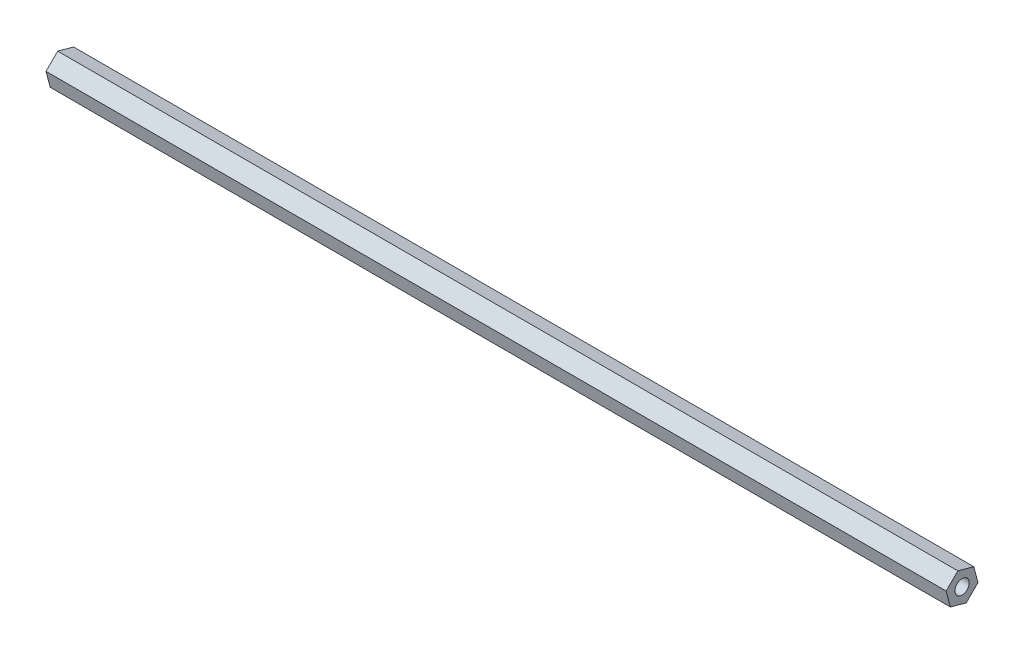
ISO-10303-21;
HEADER;
FILE_DESCRIPTION(('STEP AP214'),'2;1');
FILE_NAME('part.step','',(''),(''),'','','');
FILE_SCHEMA(('AUTOMOTIVE_DESIGN { 1 0 10303 214 1 1 1 1 }'));
ENDSEC;
DATA;
#1=APPLICATION_CONTEXT('core data for automotive mechanical design processes');
#2=APPLICATION_PROTOCOL_DEFINITION('international standard','automotive_design',2000,#1);
#3=PRODUCT_CONTEXT('',#1,'mechanical');
#4=PRODUCT('Part','Part','',(#3));
#5=PRODUCT_RELATED_PRODUCT_CATEGORY('part','',(#4));
#6=PRODUCT_DEFINITION_FORMATION('','',#4);
#7=PRODUCT_DEFINITION_CONTEXT('part definition',#1,'design');
#8=PRODUCT_DEFINITION('design','',#6,#7);
#9=PRODUCT_DEFINITION_SHAPE('','',#8);
#10=(LENGTH_UNIT() NAMED_UNIT(*) SI_UNIT(.MILLI.,.METRE.));
#11=(NAMED_UNIT(*) PLANE_ANGLE_UNIT() SI_UNIT($,.RADIAN.));
#12=(NAMED_UNIT(*) SI_UNIT($,.STERADIAN.) SOLID_ANGLE_UNIT());
#13=UNCERTAINTY_MEASURE_WITH_UNIT(LENGTH_MEASURE(1.E-05),#10,'distance_accuracy_value','');
#14=(GEOMETRIC_REPRESENTATION_CONTEXT(3) GLOBAL_UNCERTAINTY_ASSIGNED_CONTEXT((#13)) GLOBAL_UNIT_ASSIGNED_CONTEXT((#10,
#11,#12)) REPRESENTATION_CONTEXT('',''));
#15=CARTESIAN_POINT('',(0.,0.,0.));
#16=DIRECTION('',(0.,0.,1.));
#17=DIRECTION('',(1.,0.,0.));
#18=AXIS2_PLACEMENT_3D('',#15,#16,#17);
#19=CARTESIAN_POINT('',(400.05,-1.92681784977775,-7.07465238065527));
#20=DIRECTION('',(0.,-0.254850544088576,0.9669804549099));
#21=DIRECTION('',(0.,-0.9669804549099,-0.254850544088576));
#22=AXIS2_PLACEMENT_3D('',#19,#20,#21);
#23=PLANE('',#22);
#24=DIRECTION('',(0.,0.9669804549099,0.254850544088576));
#25=VECTOR('',#24,1.);
#26=CARTESIAN_POINT('',(0.,-1.92681784977775,-7.07465238065527));
#27=LINE('',#26,#25);
#28=CARTESIAN_POINT('',(0.,-1.92681784977775,-7.07465238065527));
#29=VERTEX_POINT('',#28);
#30=CARTESIAN_POINT('',(0.,5.16341975970264,-5.20599939670046));
#31=VERTEX_POINT('',#30);
#32=EDGE_CURVE('E120',#29,#31,#27,.T.);
#33=ORIENTED_EDGE('',*,*,#32,.T.);
#34=DIRECTION('',(-1.,0.,0.));
#35=VECTOR('',#34,1.);
#36=CARTESIAN_POINT('',(400.05,5.16341975970264,-5.20599939670046));
#37=LINE('',#36,#35);
#38=CARTESIAN_POINT('',(400.05,5.16341975970264,-5.20599939670046));
#39=VERTEX_POINT('',#38);
#40=EDGE_CURVE('E11',#39,#31,#37,.T.);
#41=ORIENTED_EDGE('',*,*,#40,.F.);
#42=DIRECTION('',(0.,0.9669804549099,0.254850544088576));
#43=VECTOR('',#42,1.);
#44=CARTESIAN_POINT('',(400.05,-1.92681784977775,-7.07465238065527));
#45=LINE('',#44,#43);
#46=CARTESIAN_POINT('',(400.05,-1.92681784977775,-7.07465238065527));
#47=VERTEX_POINT('',#46);
#48=EDGE_CURVE('E131',#47,#39,#45,.T.);
#49=ORIENTED_EDGE('',*,*,#48,.F.);
#50=DIRECTION('',(-1.,0.,0.));
#51=VECTOR('',#50,1.);
#52=CARTESIAN_POINT('',(400.05,-1.92681784977775,-7.07465238065527));
#53=LINE('',#52,#51);
#54=EDGE_CURVE('E116',#47,#29,#53,.T.);
#55=ORIENTED_EDGE('',*,*,#54,.T.);
#56=EDGE_LOOP('',(#33,#41,#49,#55));
#57=FACE_BOUND('',#56,.T.);
#58=ADVANCED_FACE('F36',(#57),#23,.F.);
#59=CARTESIAN_POINT('',(400.05,5.16341975970264,-5.20599939670046));
#60=DIRECTION('',(0.,-0.964854910959294,0.262783182105958));
#61=DIRECTION('',(0.,-0.262783182105958,-0.964854910959294));
#62=AXIS2_PLACEMENT_3D('',#59,#60,#61);
#63=PLANE('',#62);
#64=DIRECTION('',(0.,0.262783182105958,0.964854910959294));
#65=VECTOR('',#64,1.);
#66=CARTESIAN_POINT('',(0.,5.16341975970264,-5.20599939670046));
#67=LINE('',#66,#65);
#68=CARTESIAN_POINT('',(0.,7.09023760948039,1.8686529839548));
#69=VERTEX_POINT('',#68);
#70=EDGE_CURVE('E123',#31,#69,#67,.T.);
#71=ORIENTED_EDGE('',*,*,#70,.T.);
#72=DIRECTION('',(-1.,0.,0.));
#73=VECTOR('',#72,1.);
#74=CARTESIAN_POINT('',(400.05,7.09023760948039,1.8686529839548));
#75=LINE('',#74,#73);
#76=CARTESIAN_POINT('',(400.05,7.09023760948039,1.8686529839548));
#77=VERTEX_POINT('',#76);
#78=EDGE_CURVE('E44',#77,#69,#75,.T.);
#79=ORIENTED_EDGE('',*,*,#78,.F.);
#80=DIRECTION('',(0.,0.262783182105958,0.964854910959294));
#81=VECTOR('',#80,1.);
#82=CARTESIAN_POINT('',(400.05,5.16341975970264,-5.20599939670046));
#83=LINE('',#82,#81);
#84=EDGE_CURVE('E89',#39,#77,#83,.T.);
#85=ORIENTED_EDGE('',*,*,#84,.F.);
#86=ORIENTED_EDGE('',*,*,#40,.T.);
#87=EDGE_LOOP('',(#71,#79,#85,#86));
#88=FACE_BOUND('',#87,.T.);
#89=ADVANCED_FACE('F156',(#88),#63,.F.);
#90=CARTESIAN_POINT('',(400.05,7.09023760948039,1.8686529839548));
#91=DIRECTION('',(0.,-0.710004366870719,-0.704197272803942));
#92=DIRECTION('',(0.,0.704197272803942,-0.710004366870719));
#93=AXIS2_PLACEMENT_3D('',#90,#91,#92);
#94=PLANE('',#93);
#95=DIRECTION('',(0.,-0.704197272803942,0.710004366870719));
#96=VECTOR('',#95,1.);
#97=CARTESIAN_POINT('',(0.,7.09023760948039,1.8686529839548));
#98=LINE('',#97,#96);
#99=CARTESIAN_POINT('',(0.,1.92681784977774,7.07465238065526));
#100=VERTEX_POINT('',#99);
#101=EDGE_CURVE('E126',#69,#100,#98,.T.);
#102=ORIENTED_EDGE('',*,*,#101,.T.);
#103=DIRECTION('',(-1.,0.,0.));
#104=VECTOR('',#103,1.);
#105=CARTESIAN_POINT('',(400.05,1.92681784977774,7.07465238065526));
#106=LINE('',#105,#104);
#107=CARTESIAN_POINT('',(400.05,1.92681784977774,7.07465238065526));
#108=VERTEX_POINT('',#107);
#109=EDGE_CURVE('E111',#108,#100,#106,.T.);
#110=ORIENTED_EDGE('',*,*,#109,.F.);
#111=DIRECTION('',(0.,-0.704197272803942,0.710004366870719));
#112=VECTOR('',#111,1.);
#113=CARTESIAN_POINT('',(400.05,7.09023760948039,1.8686529839548));
#114=LINE('',#113,#112);
#115=EDGE_CURVE('E102',#77,#108,#114,.T.);
#116=ORIENTED_EDGE('',*,*,#115,.F.);
#117=ORIENTED_EDGE('',*,*,#78,.T.);
#118=EDGE_LOOP('',(#102,#110,#116,#117));
#119=FACE_BOUND('',#118,.T.);
#120=ADVANCED_FACE('F137',(#119),#94,.F.);
#121=CARTESIAN_POINT('',(400.05,1.92681784977774,7.07465238065526));
#122=DIRECTION('',(0.,0.254850544088575,-0.9669804549099));
#123=DIRECTION('',(0.,0.9669804549099,0.254850544088575));
#124=AXIS2_PLACEMENT_3D('',#121,#122,#123);
#125=PLANE('',#124);
#126=DIRECTION('',(0.,-0.9669804549099,-0.254850544088575));
#127=VECTOR('',#126,1.);
#128=CARTESIAN_POINT('',(0.,1.92681784977774,7.07465238065526));
#129=LINE('',#128,#127);
#130=CARTESIAN_POINT('',(0.,-5.16341975970264,5.20599939670046));
#131=VERTEX_POINT('',#130);
#132=EDGE_CURVE('E110',#100,#131,#129,.T.);
#133=ORIENTED_EDGE('',*,*,#132,.T.);
#134=DIRECTION('',(-1.,0.,0.));
#135=VECTOR('',#134,1.);
#136=CARTESIAN_POINT('',(400.05,-5.16341975970264,5.20599939670046));
#137=LINE('',#136,#135);
#138=CARTESIAN_POINT('',(400.05,-5.16341975970264,5.20599939670046));
#139=VERTEX_POINT('',#138);
#140=EDGE_CURVE('E107',#139,#131,#137,.T.);
#141=ORIENTED_EDGE('',*,*,#140,.F.);
#142=DIRECTION('',(0.,-0.9669804549099,-0.254850544088575));
#143=VECTOR('',#142,1.);
#144=CARTESIAN_POINT('',(400.05,1.92681784977774,7.07465238065526));
#145=LINE('',#144,#143);
#146=EDGE_CURVE('E96',#108,#139,#145,.T.);
#147=ORIENTED_EDGE('',*,*,#146,.F.);
#148=ORIENTED_EDGE('',*,*,#109,.T.);
#149=EDGE_LOOP('',(#133,#141,#147,#148));
#150=FACE_BOUND('',#149,.T.);
#151=ADVANCED_FACE('F108',(#150),#125,.F.);
#152=CARTESIAN_POINT('',(400.05,-5.16341975970264,5.20599939670046));
#153=DIRECTION('',(0.,0.964854910959294,-0.262783182105958));
#154=DIRECTION('',(0.,0.262783182105958,0.964854910959294));
#155=AXIS2_PLACEMENT_3D('',#152,#153,#154);
#156=PLANE('',#155);
#157=DIRECTION('',(0.,-0.262783182105958,-0.964854910959294));
#158=VECTOR('',#157,1.);
#159=CARTESIAN_POINT('',(0.,-5.16341975970264,5.20599939670046));
#160=LINE('',#159,#158);
#161=CARTESIAN_POINT('',(0.,-7.09023760948039,-1.86865298395481));
#162=VERTEX_POINT('',#161);
#163=EDGE_CURVE('E75',#131,#162,#160,.T.);
#164=ORIENTED_EDGE('',*,*,#163,.T.);
#165=DIRECTION('',(-1.,0.,0.));
#166=VECTOR('',#165,1.);
#167=CARTESIAN_POINT('',(400.05,-7.09023760948039,-1.86865298395481));
#168=LINE('',#167,#166);
#169=CARTESIAN_POINT('',(400.05,-7.09023760948039,-1.86865298395481));
#170=VERTEX_POINT('',#169);
#171=EDGE_CURVE('E112',#170,#162,#168,.T.);
#172=ORIENTED_EDGE('',*,*,#171,.F.);
#173=DIRECTION('',(0.,-0.262783182105958,-0.964854910959294));
#174=VECTOR('',#173,1.);
#175=CARTESIAN_POINT('',(400.05,-5.16341975970264,5.20599939670046));
#176=LINE('',#175,#174);
#177=EDGE_CURVE('E100',#139,#170,#176,.T.);
#178=ORIENTED_EDGE('',*,*,#177,.F.);
#179=ORIENTED_EDGE('',*,*,#140,.T.);
#180=EDGE_LOOP('',(#164,#172,#178,#179));
#181=FACE_BOUND('',#180,.T.);
#182=ADVANCED_FACE('F114',(#181),#156,.F.);
#183=CARTESIAN_POINT('',(400.05,-7.09023760948039,-1.86865298395481));
#184=DIRECTION('',(0.,0.710004366870719,0.704197272803942));
#185=DIRECTION('',(0.,-0.704197272803942,0.710004366870719));
#186=AXIS2_PLACEMENT_3D('',#183,#184,#185);
#187=PLANE('',#186);
#188=DIRECTION('',(0.,0.704197272803942,-0.710004366870719));
#189=VECTOR('',#188,1.);
#190=CARTESIAN_POINT('',(0.,-7.09023760948039,-1.86865298395481));
#191=LINE('',#190,#189);
#192=EDGE_CURVE('E81',#162,#29,#191,.T.);
#193=ORIENTED_EDGE('',*,*,#192,.T.);
#194=ORIENTED_EDGE('',*,*,#54,.F.);
#195=DIRECTION('',(0.,0.704197272803942,-0.710004366870719));
#196=VECTOR('',#195,1.);
#197=CARTESIAN_POINT('',(400.05,-7.09023760948039,-1.86865298395481));
#198=LINE('',#197,#196);
#199=EDGE_CURVE('E52',#170,#47,#198,.T.);
#200=ORIENTED_EDGE('',*,*,#199,.F.);
#201=ORIENTED_EDGE('',*,*,#171,.T.);
#202=EDGE_LOOP('',(#193,#194,#200,#201));
#203=FACE_BOUND('',#202,.T.);
#204=ADVANCED_FACE('F144',(#203),#187,.F.);
#205=CARTESIAN_POINT('',(400.05,0.,0.));
#206=DIRECTION('',(1.,0.,0.));
#207=DIRECTION('',(0.,0.,-1.));
#208=AXIS2_PLACEMENT_3D('',#205,#206,#207);
#209=PLANE('',#208);
#210=CARTESIAN_POINT('',(400.05,0.,0.));
#211=DIRECTION('',(1.,0.,0.));
#212=DIRECTION('',(0.,0.,-1.));
#213=AXIS2_PLACEMENT_3D('',#210,#211,#212);
#214=CIRCLE('',#213,3.175);
#215=CARTESIAN_POINT('',(400.05,0.,-3.175));
#216=VERTEX_POINT('',#215);
#217=EDGE_CURVE('E211',#216,#216,#214,.T.);
#218=ORIENTED_EDGE('',*,*,#217,.F.);
#219=EDGE_LOOP('',(#218));
#220=FACE_BOUND('',#219,.T.);
#221=ORIENTED_EDGE('',*,*,#48,.T.);
#222=ORIENTED_EDGE('',*,*,#84,.T.);
#223=ORIENTED_EDGE('',*,*,#115,.T.);
#224=ORIENTED_EDGE('',*,*,#146,.T.);
#225=ORIENTED_EDGE('',*,*,#177,.T.);
#226=ORIENTED_EDGE('',*,*,#199,.T.);
#227=EDGE_LOOP('',(#221,#222,#223,#224,#225,#226));
#228=FACE_BOUND('',#227,.T.);
#229=ADVANCED_FACE('F98',(#220,#228),#209,.T.);
#230=CARTESIAN_POINT('',(0.,0.,0.));
#231=DIRECTION('',(1.,0.,0.));
#232=DIRECTION('',(0.,0.,-1.));
#233=AXIS2_PLACEMENT_3D('',#230,#231,#232);
#234=PLANE('',#233);
#235=CARTESIAN_POINT('',(0.,0.,0.));
#236=DIRECTION('',(1.,0.,0.));
#237=DIRECTION('',(0.,0.,-1.));
#238=AXIS2_PLACEMENT_3D('',#235,#236,#237);
#239=CIRCLE('',#238,3.175);
#240=CARTESIAN_POINT('',(0.,0.,-3.175));
#241=VERTEX_POINT('',#240);
#242=EDGE_CURVE('E124',#241,#241,#239,.T.);
#243=ORIENTED_EDGE('',*,*,#242,.T.);
#244=EDGE_LOOP('',(#243));
#245=FACE_BOUND('',#244,.T.);
#246=ORIENTED_EDGE('',*,*,#32,.F.);
#247=ORIENTED_EDGE('',*,*,#192,.F.);
#248=ORIENTED_EDGE('',*,*,#163,.F.);
#249=ORIENTED_EDGE('',*,*,#132,.F.);
#250=ORIENTED_EDGE('',*,*,#101,.F.);
#251=ORIENTED_EDGE('',*,*,#70,.F.);
#252=EDGE_LOOP('',(#246,#247,#248,#249,#250,#251));
#253=FACE_BOUND('',#252,.T.);
#254=ADVANCED_FACE('F140',(#245,#253),#234,.F.);
#255=CARTESIAN_POINT('',(0.,0.,0.));
#256=DIRECTION('',(1.,0.,0.));
#257=DIRECTION('',(0.,0.,-1.));
#258=AXIS2_PLACEMENT_3D('',#255,#256,#257);
#259=CYLINDRICAL_SURFACE('',#258,3.175);
#260=CARTESIAN_POINT('',(0.,0.,-3.175));
#261=CARTESIAN_POINT('',(4.1671875,0.,-3.175));
#262=CARTESIAN_POINT('',(8.334375,0.,-3.175));
#263=CARTESIAN_POINT('',(16.66875,0.,-3.175));
#264=CARTESIAN_POINT('',(20.8359375,0.,-3.175));
#265=CARTESIAN_POINT('',(29.1703125,0.,-3.175));
#266=CARTESIAN_POINT('',(33.3375,0.,-3.175));
#267=CARTESIAN_POINT('',(41.671875,0.,-3.175));
#268=CARTESIAN_POINT('',(45.8390625,0.,-3.175));
#269=CARTESIAN_POINT('',(54.1734375,0.,-3.175));
#270=CARTESIAN_POINT('',(58.340625,0.,-3.175));
#271=CARTESIAN_POINT('',(66.675,0.,-3.175));
#272=CARTESIAN_POINT('',(70.8421875,0.,-3.175));
#273=CARTESIAN_POINT('',(79.1765625,0.,-3.175));
#274=CARTESIAN_POINT('',(83.34375,0.,-3.175));
#275=CARTESIAN_POINT('',(91.678125,0.,-3.175));
#276=CARTESIAN_POINT('',(95.8453125,0.,-3.175));
#277=CARTESIAN_POINT('',(104.1796875,0.,-3.175));
#278=CARTESIAN_POINT('',(108.346875,0.,-3.175));
#279=CARTESIAN_POINT('',(116.68125,0.,-3.175));
#280=CARTESIAN_POINT('',(120.8484375,0.,-3.175));
#281=CARTESIAN_POINT('',(129.1828125,0.,-3.175));
#282=CARTESIAN_POINT('',(133.35,0.,-3.175));
#283=CARTESIAN_POINT('',(141.684375,0.,-3.175));
#284=CARTESIAN_POINT('',(145.8515625,0.,-3.175));
#285=CARTESIAN_POINT('',(154.1859375,0.,-3.175));
#286=CARTESIAN_POINT('',(158.353125,0.,-3.175));
#287=CARTESIAN_POINT('',(166.6875,0.,-3.175));
#288=CARTESIAN_POINT('',(170.8546875,0.,-3.175));
#289=CARTESIAN_POINT('',(179.1890625,0.,-3.175));
#290=CARTESIAN_POINT('',(183.35625,0.,-3.175));
#291=CARTESIAN_POINT('',(191.690625,0.,-3.175));
#292=CARTESIAN_POINT('',(195.8578125,0.,-3.175));
#293=CARTESIAN_POINT('',(204.1921875,0.,-3.175));
#294=CARTESIAN_POINT('',(208.359375,0.,-3.175));
#295=CARTESIAN_POINT('',(216.69375,0.,-3.175));
#296=CARTESIAN_POINT('',(220.8609375,0.,-3.175));
#297=CARTESIAN_POINT('',(229.1953125,0.,-3.175));
#298=CARTESIAN_POINT('',(233.3625,0.,-3.175));
#299=CARTESIAN_POINT('',(241.696875,0.,-3.175));
#300=CARTESIAN_POINT('',(245.8640625,0.,-3.175));
#301=CARTESIAN_POINT('',(254.1984375,0.,-3.175));
#302=CARTESIAN_POINT('',(258.365625,0.,-3.175));
#303=CARTESIAN_POINT('',(266.7,0.,-3.175));
#304=CARTESIAN_POINT('',(270.8671875,0.,-3.175));
#305=CARTESIAN_POINT('',(279.2015625,0.,-3.175));
#306=CARTESIAN_POINT('',(283.36875,0.,-3.175));
#307=CARTESIAN_POINT('',(291.703125,0.,-3.175));
#308=CARTESIAN_POINT('',(295.8703125,0.,-3.175));
#309=CARTESIAN_POINT('',(304.2046875,0.,-3.175));
#310=CARTESIAN_POINT('',(308.371875,0.,-3.175));
#311=CARTESIAN_POINT('',(316.70625,0.,-3.175));
#312=CARTESIAN_POINT('',(320.8734375,0.,-3.175));
#313=CARTESIAN_POINT('',(329.2078125,0.,-3.175));
#314=CARTESIAN_POINT('',(333.375,0.,-3.175));
#315=CARTESIAN_POINT('',(341.709375,0.,-3.175));
#316=CARTESIAN_POINT('',(345.8765625,0.,-3.175));
#317=CARTESIAN_POINT('',(354.2109375,0.,-3.175));
#318=CARTESIAN_POINT('',(358.378125,0.,-3.175));
#319=CARTESIAN_POINT('',(366.7125,0.,-3.175));
#320=CARTESIAN_POINT('',(370.8796875,0.,-3.175));
#321=CARTESIAN_POINT('',(379.2140625,0.,-3.175));
#322=CARTESIAN_POINT('',(383.38125,0.,-3.175));
#323=CARTESIAN_POINT('',(391.715625,0.,-3.175));
#324=CARTESIAN_POINT('',(395.8828125,0.,-3.175));
#325=CARTESIAN_POINT('',(400.05,0.,-3.175));
#326=B_SPLINE_CURVE_WITH_KNOTS('',3,(#260,#261,#262,#263,#264,#265,#266,#267,#268,#269,#270,
#271,#272,#273,#274,#275,#276,#277,#278,#279,#280,#281,#282,#283,#284,#285,#286,#287,#288,#289,
#290,#291,#292,#293,#294,#295,#296,#297,#298,#299,#300,#301,#302,#303,#304,#305,#306,#307,#308,
#309,#310,#311,#312,#313,#314,#315,#316,#317,#318,#319,#320,#321,#322,#323,#324,#325),
.UNSPECIFIED.,.F.,.F.,(4,2,2,2,2,2,2,2,2,2,2,2,2,2,2,2,2,2,2,2,2,2,2,2,2,2,2,2,2,2,2,2,4),(0.,
12.5015625,25.003125,37.5046875,50.00625,62.5078125,75.009375,87.5109375,100.0125,112.5140625,
125.015625,137.5171875,150.01875,162.5203125,175.021875,187.5234375,200.025,212.5265625,
225.028125,237.5296875,250.03125,262.5328125,275.034375,287.5359375,300.0375,312.5390625,
325.040625,337.5421875,350.04375,362.5453125,375.046875,387.5484375,400.05),.UNSPECIFIED.);
#327=EDGE_CURVE('BSEAM193',#241,#216,#326,.T.);
#328=ORIENTED_EDGE('',*,*,#242,.F.);
#329=ORIENTED_EDGE('',*,*,#217,.T.);
#330=ORIENTED_EDGE('',*,*,#327,.T.);
#331=ORIENTED_EDGE('',*,*,#327,.F.);
#332=EDGE_LOOP('',(#328,#330,#329,#331));
#333=FACE_BOUND('',#332,.T.);
#334=ADVANCED_FACE('F193',(#333),#259,.F.);
#335=CLOSED_SHELL('',(#58,#89,#120,#151,#182,#204,#229,#254,#334));
#336=MANIFOLD_SOLID_BREP('B2',#335);
#337=ADVANCED_BREP_SHAPE_REPRESENTATION('',(#18,#336),#14);
#338=SHAPE_DEFINITION_REPRESENTATION(#9,#337);
ENDSEC;
END-ISO-10303-21;
